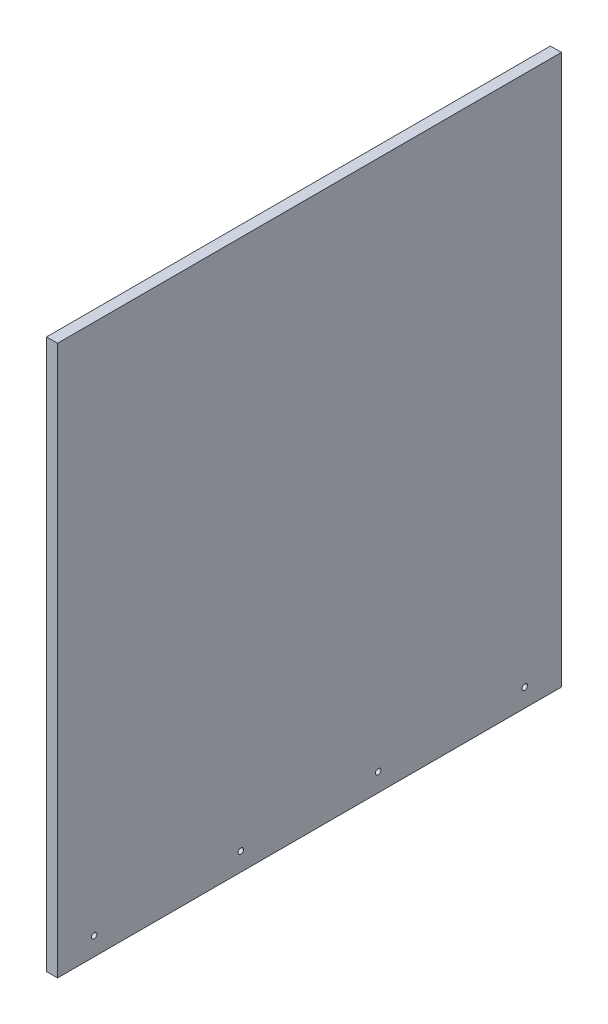
ISO-10303-21;
HEADER;
FILE_DESCRIPTION(('STEP AP214'),'2;1');
FILE_NAME('part.step','',(''),(''),'','','');
FILE_SCHEMA(('AUTOMOTIVE_DESIGN { 1 0 10303 214 1 1 1 1 }'));
ENDSEC;
DATA;
#1=APPLICATION_CONTEXT('core data for automotive mechanical design processes');
#2=APPLICATION_PROTOCOL_DEFINITION('international standard','automotive_design',2000,#1);
#3=PRODUCT_CONTEXT('',#1,'mechanical');
#4=PRODUCT('Part','Part','',(#3));
#5=PRODUCT_RELATED_PRODUCT_CATEGORY('part','',(#4));
#6=PRODUCT_DEFINITION_FORMATION('','',#4);
#7=PRODUCT_DEFINITION_CONTEXT('part definition',#1,'design');
#8=PRODUCT_DEFINITION('design','',#6,#7);
#9=PRODUCT_DEFINITION_SHAPE('','',#8);
#10=(LENGTH_UNIT() NAMED_UNIT(*) SI_UNIT(.MILLI.,.METRE.));
#11=(NAMED_UNIT(*) PLANE_ANGLE_UNIT() SI_UNIT($,.RADIAN.));
#12=(NAMED_UNIT(*) SI_UNIT($,.STERADIAN.) SOLID_ANGLE_UNIT());
#13=UNCERTAINTY_MEASURE_WITH_UNIT(LENGTH_MEASURE(1.E-05),#10,'distance_accuracy_value','');
#14=(GEOMETRIC_REPRESENTATION_CONTEXT(3) GLOBAL_UNCERTAINTY_ASSIGNED_CONTEXT((#13)) GLOBAL_UNIT_ASSIGNED_CONTEXT((#10,
#11,#12)) REPRESENTATION_CONTEXT('',''));
#15=CARTESIAN_POINT('',(0.,0.,0.));
#16=DIRECTION('',(0.,0.,1.));
#17=DIRECTION('',(1.,0.,0.));
#18=AXIS2_PLACEMENT_3D('',#15,#16,#17);
#19=CARTESIAN_POINT('',(-3.,150.,137.5));
#20=DIRECTION('',(1.,0.,0.));
#21=DIRECTION('',(0.,1.,0.));
#22=AXIS2_PLACEMENT_3D('',#19,#20,#21);
#23=PLANE('',#22);
#24=CARTESIAN_POINT('',(-3.,-140.,117.5));
#25=DIRECTION('',(1.,0.,0.));
#26=DIRECTION('',(0.,0.,-1.));
#27=AXIS2_PLACEMENT_3D('',#24,#25,#26);
#28=CIRCLE('',#27,1.5);
#29=CARTESIAN_POINT('',(-3.,-140.,116.));
#30=VERTEX_POINT('',#29);
#31=EDGE_CURVE('E154',#30,#30,#28,.T.);
#32=ORIENTED_EDGE('',*,*,#31,.T.);
#33=EDGE_LOOP('',(#32));
#34=FACE_BOUND('',#33,.T.);
#35=CARTESIAN_POINT('',(-3.,-140.,37.5));
#36=DIRECTION('',(1.,0.,0.));
#37=DIRECTION('',(0.,0.,-1.));
#38=AXIS2_PLACEMENT_3D('',#35,#36,#37);
#39=CIRCLE('',#38,1.5);
#40=CARTESIAN_POINT('',(-3.,-140.,36.));
#41=VERTEX_POINT('',#40);
#42=EDGE_CURVE('E150',#41,#41,#39,.T.);
#43=ORIENTED_EDGE('',*,*,#42,.T.);
#44=EDGE_LOOP('',(#43));
#45=FACE_BOUND('',#44,.T.);
#46=CARTESIAN_POINT('',(-3.,-140.,-37.5));
#47=DIRECTION('',(1.,0.,0.));
#48=DIRECTION('',(0.,0.,1.));
#49=AXIS2_PLACEMENT_3D('',#46,#47,#48);
#50=CIRCLE('',#49,1.5);
#51=CARTESIAN_POINT('',(-3.,-140.,-36.));
#52=VERTEX_POINT('',#51);
#53=EDGE_CURVE('E142',#52,#52,#50,.T.);
#54=ORIENTED_EDGE('',*,*,#53,.T.);
#55=EDGE_LOOP('',(#54));
#56=FACE_BOUND('',#55,.T.);
#57=CARTESIAN_POINT('',(-3.,-140.,-117.5));
#58=DIRECTION('',(1.,0.,0.));
#59=DIRECTION('',(0.,0.,1.));
#60=AXIS2_PLACEMENT_3D('',#57,#58,#59);
#61=CIRCLE('',#60,1.5);
#62=CARTESIAN_POINT('',(-3.,-140.,-116.));
#63=VERTEX_POINT('',#62);
#64=EDGE_CURVE('E133',#63,#63,#61,.T.);
#65=ORIENTED_EDGE('',*,*,#64,.T.);
#66=EDGE_LOOP('',(#65));
#67=FACE_BOUND('',#66,.T.);
#68=DIRECTION('',(0.,-1.,0.));
#69=VECTOR('',#68,1.);
#70=CARTESIAN_POINT('',(-3.,150.,-137.5));
#71=LINE('',#70,#69);
#72=CARTESIAN_POINT('',(-3.,150.,-137.5));
#73=VERTEX_POINT('',#72);
#74=CARTESIAN_POINT('',(-2.99999999999998,-150.,-137.5));
#75=VERTEX_POINT('',#74);
#76=EDGE_CURVE('E112',#73,#75,#71,.T.);
#77=ORIENTED_EDGE('',*,*,#76,.T.);
#78=DIRECTION('',(0.,0.,-1.));
#79=VECTOR('',#78,1.);
#80=CARTESIAN_POINT('',(-2.99999999999998,-150.,137.5));
#81=LINE('',#80,#79);
#82=CARTESIAN_POINT('',(-2.99999999999998,-150.,137.5));
#83=VERTEX_POINT('',#82);
#84=EDGE_CURVE('E11',#83,#75,#81,.T.);
#85=ORIENTED_EDGE('',*,*,#84,.F.);
#86=DIRECTION('',(0.,-1.,0.));
#87=VECTOR('',#86,1.);
#88=CARTESIAN_POINT('',(-3.,150.,137.5));
#89=LINE('',#88,#87);
#90=CARTESIAN_POINT('',(-3.,150.,137.5));
#91=VERTEX_POINT('',#90);
#92=EDGE_CURVE('E96',#91,#83,#89,.T.);
#93=ORIENTED_EDGE('',*,*,#92,.F.);
#94=DIRECTION('',(0.,0.,-1.));
#95=VECTOR('',#94,1.);
#96=CARTESIAN_POINT('',(-3.,150.,137.5));
#97=LINE('',#96,#95);
#98=EDGE_CURVE('E108',#91,#73,#97,.T.);
#99=ORIENTED_EDGE('',*,*,#98,.T.);
#100=EDGE_LOOP('',(#77,#85,#93,#99));
#101=FACE_BOUND('',#100,.T.);
#102=ADVANCED_FACE('F44',(#34,#45,#56,#67,#101),#23,.F.);
#103=CARTESIAN_POINT('',(-2.99999999999998,-150.,137.5));
#104=DIRECTION('',(0.,1.,0.));
#105=DIRECTION('',(0.,0.,1.));
#106=AXIS2_PLACEMENT_3D('',#103,#104,#105);
#107=PLANE('',#106);
#108=DIRECTION('',(1.,0.,0.));
#109=VECTOR('',#108,1.);
#110=CARTESIAN_POINT('',(-2.99999999999998,-150.,-137.5));
#111=LINE('',#110,#109);
#112=CARTESIAN_POINT('',(3.00000000000004,-150.,-137.5));
#113=VERTEX_POINT('',#112);
#114=EDGE_CURVE('E101',#75,#113,#111,.T.);
#115=ORIENTED_EDGE('',*,*,#114,.T.);
#116=DIRECTION('',(0.,0.,-1.));
#117=VECTOR('',#116,1.);
#118=CARTESIAN_POINT('',(3.00000000000004,-150.,137.5));
#119=LINE('',#118,#117);
#120=CARTESIAN_POINT('',(3.00000000000004,-150.,137.5));
#121=VERTEX_POINT('',#120);
#122=EDGE_CURVE('E53',#121,#113,#119,.T.);
#123=ORIENTED_EDGE('',*,*,#122,.F.);
#124=DIRECTION('',(1.,0.,0.));
#125=VECTOR('',#124,1.);
#126=CARTESIAN_POINT('',(-2.99999999999998,-150.,137.5));
#127=LINE('',#126,#125);
#128=EDGE_CURVE('E91',#83,#121,#127,.T.);
#129=ORIENTED_EDGE('',*,*,#128,.F.);
#130=ORIENTED_EDGE('',*,*,#84,.T.);
#131=EDGE_LOOP('',(#115,#123,#129,#130));
#132=FACE_BOUND('',#131,.T.);
#133=ADVANCED_FACE('F100',(#132),#107,.F.);
#134=CARTESIAN_POINT('',(3.,150.,137.5));
#135=DIRECTION('',(-1.,0.,0.));
#136=DIRECTION('',(0.,-1.,0.));
#137=AXIS2_PLACEMENT_3D('',#134,#135,#136);
#138=PLANE('',#137);
#139=CARTESIAN_POINT('',(3.00000000000004,-140.,117.5));
#140=DIRECTION('',(1.,0.,0.));
#141=DIRECTION('',(0.,0.,-1.));
#142=AXIS2_PLACEMENT_3D('',#139,#140,#141);
#143=CIRCLE('',#142,1.5);
#144=CARTESIAN_POINT('',(3.00000000000004,-140.,116.));
#145=VERTEX_POINT('',#144);
#146=EDGE_CURVE('E116',#145,#145,#143,.T.);
#147=ORIENTED_EDGE('',*,*,#146,.F.);
#148=EDGE_LOOP('',(#147));
#149=FACE_BOUND('',#148,.T.);
#150=CARTESIAN_POINT('',(3.00000000000004,-140.,37.5));
#151=DIRECTION('',(1.,0.,0.));
#152=DIRECTION('',(0.,0.,-1.));
#153=AXIS2_PLACEMENT_3D('',#150,#151,#152);
#154=CIRCLE('',#153,1.5);
#155=CARTESIAN_POINT('',(3.00000000000004,-140.,36.));
#156=VERTEX_POINT('',#155);
#157=EDGE_CURVE('E146',#156,#156,#154,.T.);
#158=ORIENTED_EDGE('',*,*,#157,.F.);
#159=EDGE_LOOP('',(#158));
#160=FACE_BOUND('',#159,.T.);
#161=CARTESIAN_POINT('',(3.00000000000004,-140.,-37.5));
#162=DIRECTION('',(1.,0.,0.));
#163=DIRECTION('',(0.,0.,1.));
#164=AXIS2_PLACEMENT_3D('',#161,#162,#163);
#165=CIRCLE('',#164,1.5);
#166=CARTESIAN_POINT('',(3.00000000000004,-140.,-36.));
#167=VERTEX_POINT('',#166);
#168=EDGE_CURVE('E137',#167,#167,#165,.T.);
#169=ORIENTED_EDGE('',*,*,#168,.F.);
#170=EDGE_LOOP('',(#169));
#171=FACE_BOUND('',#170,.T.);
#172=CARTESIAN_POINT('',(3.00000000000004,-140.,-117.5));
#173=DIRECTION('',(1.,0.,0.));
#174=DIRECTION('',(0.,0.,1.));
#175=AXIS2_PLACEMENT_3D('',#172,#173,#174);
#176=CIRCLE('',#175,1.5);
#177=CARTESIAN_POINT('',(3.00000000000004,-140.,-116.));
#178=VERTEX_POINT('',#177);
#179=EDGE_CURVE('E138',#178,#178,#176,.T.);
#180=ORIENTED_EDGE('',*,*,#179,.F.);
#181=EDGE_LOOP('',(#180));
#182=FACE_BOUND('',#181,.T.);
#183=DIRECTION('',(0.,1.,0.));
#184=VECTOR('',#183,1.);
#185=CARTESIAN_POINT('',(3.,150.,-137.5));
#186=LINE('',#185,#184);
#187=CARTESIAN_POINT('',(3.,150.,-137.5));
#188=VERTEX_POINT('',#187);
#189=EDGE_CURVE('E78',#113,#188,#186,.T.);
#190=ORIENTED_EDGE('',*,*,#189,.T.);
#191=DIRECTION('',(0.,0.,-1.));
#192=VECTOR('',#191,1.);
#193=CARTESIAN_POINT('',(3.,150.,137.5));
#194=LINE('',#193,#192);
#195=CARTESIAN_POINT('',(3.,150.,137.5));
#196=VERTEX_POINT('',#195);
#197=EDGE_CURVE('E103',#196,#188,#194,.T.);
#198=ORIENTED_EDGE('',*,*,#197,.F.);
#199=DIRECTION('',(0.,1.,0.));
#200=VECTOR('',#199,1.);
#201=CARTESIAN_POINT('',(3.,150.,137.5));
#202=LINE('',#201,#200);
#203=EDGE_CURVE('E94',#121,#196,#202,.T.);
#204=ORIENTED_EDGE('',*,*,#203,.F.);
#205=ORIENTED_EDGE('',*,*,#122,.T.);
#206=EDGE_LOOP('',(#190,#198,#204,#205));
#207=FACE_BOUND('',#206,.T.);
#208=ADVANCED_FACE('F104',(#149,#160,#171,#182,#207),#138,.F.);
#209=CARTESIAN_POINT('',(-3.,150.,137.5));
#210=DIRECTION('',(0.,-1.,0.));
#211=DIRECTION('',(0.,0.,-1.));
#212=AXIS2_PLACEMENT_3D('',#209,#210,#211);
#213=PLANE('',#212);
#214=DIRECTION('',(-1.,0.,0.));
#215=VECTOR('',#214,1.);
#216=CARTESIAN_POINT('',(-3.,150.,-137.5));
#217=LINE('',#216,#215);
#218=EDGE_CURVE('E84',#188,#73,#217,.T.);
#219=ORIENTED_EDGE('',*,*,#218,.T.);
#220=ORIENTED_EDGE('',*,*,#98,.F.);
#221=DIRECTION('',(-1.,0.,0.));
#222=VECTOR('',#221,1.);
#223=CARTESIAN_POINT('',(-3.,150.,137.5));
#224=LINE('',#223,#222);
#225=EDGE_CURVE('E61',#196,#91,#224,.T.);
#226=ORIENTED_EDGE('',*,*,#225,.F.);
#227=ORIENTED_EDGE('',*,*,#197,.T.);
#228=EDGE_LOOP('',(#219,#220,#226,#227));
#229=FACE_BOUND('',#228,.T.);
#230=ADVANCED_FACE('F126',(#229),#213,.F.);
#231=CARTESIAN_POINT('',(0.,0.,137.5));
#232=DIRECTION('',(0.,0.,1.));
#233=DIRECTION('',(1.,0.,0.));
#234=AXIS2_PLACEMENT_3D('',#231,#232,#233);
#235=PLANE('',#234);
#236=ORIENTED_EDGE('',*,*,#92,.T.);
#237=ORIENTED_EDGE('',*,*,#128,.T.);
#238=ORIENTED_EDGE('',*,*,#203,.T.);
#239=ORIENTED_EDGE('',*,*,#225,.T.);
#240=EDGE_LOOP('',(#236,#237,#238,#239));
#241=FACE_BOUND('',#240,.T.);
#242=ADVANCED_FACE('F92',(#241),#235,.T.);
#243=CARTESIAN_POINT('',(0.,0.,-137.5));
#244=DIRECTION('',(0.,0.,1.));
#245=DIRECTION('',(1.,0.,0.));
#246=AXIS2_PLACEMENT_3D('',#243,#244,#245);
#247=PLANE('',#246);
#248=ORIENTED_EDGE('',*,*,#76,.F.);
#249=ORIENTED_EDGE('',*,*,#218,.F.);
#250=ORIENTED_EDGE('',*,*,#189,.F.);
#251=ORIENTED_EDGE('',*,*,#114,.F.);
#252=EDGE_LOOP('',(#248,#249,#250,#251));
#253=FACE_BOUND('',#252,.T.);
#254=ADVANCED_FACE('F129',(#253),#247,.F.);
#255=CARTESIAN_POINT('',(3.00000000000004,-140.,-117.5));
#256=DIRECTION('',(-1.,0.,0.));
#257=DIRECTION('',(0.,0.,1.));
#258=AXIS2_PLACEMENT_3D('',#255,#256,#257);
#259=CYLINDRICAL_SURFACE('',#258,1.5);
#260=ORIENTED_EDGE('',*,*,#179,.T.);
#261=EDGE_LOOP('',(#260));
#262=FACE_BOUND('',#261,.T.);
#263=ORIENTED_EDGE('',*,*,#64,.F.);
#264=EDGE_LOOP('',(#263));
#265=FACE_BOUND('',#264,.T.);
#266=ADVANCED_FACE('F194',(#262,#265),#259,.F.);
#267=CARTESIAN_POINT('',(3.00000000000004,-140.,-37.5));
#268=DIRECTION('',(-1.,0.,0.));
#269=DIRECTION('',(0.,0.,1.));
#270=AXIS2_PLACEMENT_3D('',#267,#268,#269);
#271=CYLINDRICAL_SURFACE('',#270,1.5);
#272=ORIENTED_EDGE('',*,*,#168,.T.);
#273=EDGE_LOOP('',(#272));
#274=FACE_BOUND('',#273,.T.);
#275=ORIENTED_EDGE('',*,*,#53,.F.);
#276=EDGE_LOOP('',(#275));
#277=FACE_BOUND('',#276,.T.);
#278=ADVANCED_FACE('F175',(#274,#277),#271,.F.);
#279=CARTESIAN_POINT('',(3.00000000000004,-140.,37.5));
#280=DIRECTION('',(-1.,0.,0.));
#281=DIRECTION('',(0.,0.,1.));
#282=AXIS2_PLACEMENT_3D('',#279,#280,#281);
#283=CYLINDRICAL_SURFACE('',#282,1.5);
#284=ORIENTED_EDGE('',*,*,#157,.T.);
#285=EDGE_LOOP('',(#284));
#286=FACE_BOUND('',#285,.T.);
#287=ORIENTED_EDGE('',*,*,#42,.F.);
#288=EDGE_LOOP('',(#287));
#289=FACE_BOUND('',#288,.T.);
#290=ADVANCED_FACE('F169',(#286,#289),#283,.F.);
#291=CARTESIAN_POINT('',(3.00000000000004,-140.,117.5));
#292=DIRECTION('',(-1.,0.,0.));
#293=DIRECTION('',(0.,0.,1.));
#294=AXIS2_PLACEMENT_3D('',#291,#292,#293);
#295=CYLINDRICAL_SURFACE('',#294,1.5);
#296=ORIENTED_EDGE('',*,*,#146,.T.);
#297=EDGE_LOOP('',(#296));
#298=FACE_BOUND('',#297,.T.);
#299=ORIENTED_EDGE('',*,*,#31,.F.);
#300=EDGE_LOOP('',(#299));
#301=FACE_BOUND('',#300,.T.);
#302=ADVANCED_FACE('F167',(#298,#301),#295,.F.);
#303=CLOSED_SHELL('',(#102,#133,#208,#230,#242,#254,#266,#278,#290,#302));
#304=MANIFOLD_SOLID_BREP('B2',#303);
#305=ADVANCED_BREP_SHAPE_REPRESENTATION('',(#18,#304),#14);
#306=SHAPE_DEFINITION_REPRESENTATION(#9,#305);
ENDSEC;
END-ISO-10303-21;
